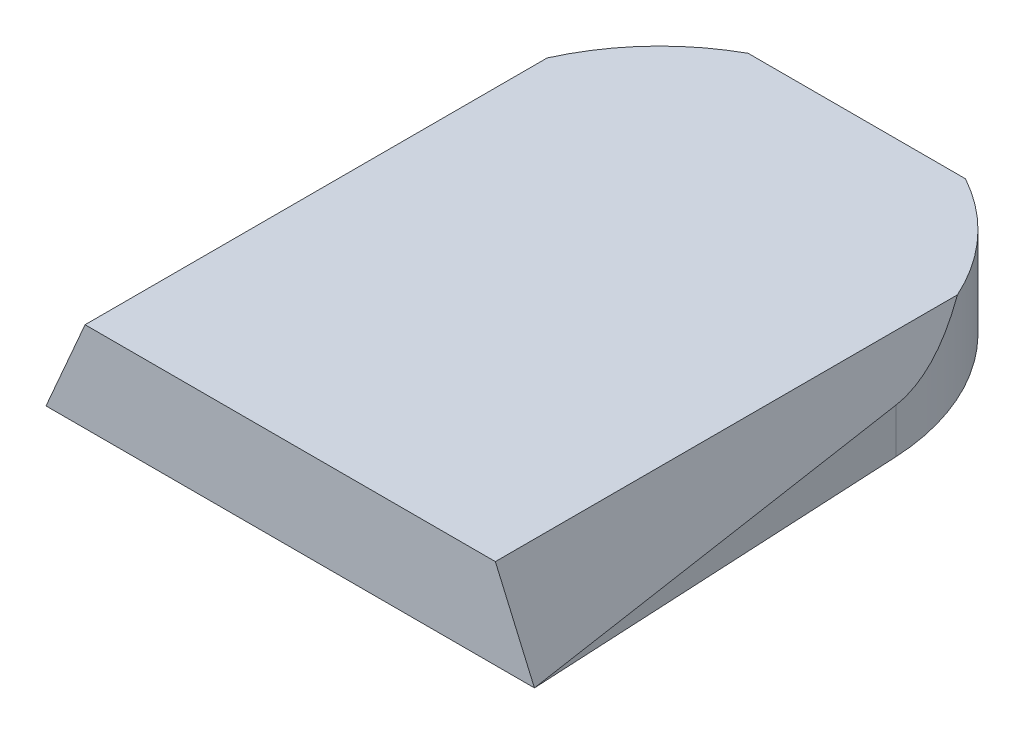
ISO-10303-21;
HEADER;
FILE_DESCRIPTION(('STEP AP214'),'2;1');
FILE_NAME('part.step','',(''),(''),'','','');
FILE_SCHEMA(('AUTOMOTIVE_DESIGN { 1 0 10303 214 1 1 1 1 }'));
ENDSEC;
DATA;
#1=APPLICATION_CONTEXT('core data for automotive mechanical design processes');
#2=APPLICATION_PROTOCOL_DEFINITION('international standard','automotive_design',2000,#1);
#3=PRODUCT_CONTEXT('',#1,'mechanical');
#4=PRODUCT('Part','Part','',(#3));
#5=PRODUCT_RELATED_PRODUCT_CATEGORY('part','',(#4));
#6=PRODUCT_DEFINITION_FORMATION('','',#4);
#7=PRODUCT_DEFINITION_CONTEXT('part definition',#1,'design');
#8=PRODUCT_DEFINITION('design','',#6,#7);
#9=PRODUCT_DEFINITION_SHAPE('','',#8);
#10=(LENGTH_UNIT() NAMED_UNIT(*) SI_UNIT(.MILLI.,.METRE.));
#11=(NAMED_UNIT(*) PLANE_ANGLE_UNIT() SI_UNIT($,.RADIAN.));
#12=(NAMED_UNIT(*) SI_UNIT($,.STERADIAN.) SOLID_ANGLE_UNIT());
#13=UNCERTAINTY_MEASURE_WITH_UNIT(LENGTH_MEASURE(1.E-05),#10,'distance_accuracy_value','');
#14=(GEOMETRIC_REPRESENTATION_CONTEXT(3) GLOBAL_UNCERTAINTY_ASSIGNED_CONTEXT((#13)) GLOBAL_UNIT_ASSIGNED_CONTEXT((#10,
#11,#12)) REPRESENTATION_CONTEXT('',''));
#15=CARTESIAN_POINT('',(0.,0.,0.));
#16=DIRECTION('',(0.,0.,1.));
#17=DIRECTION('',(1.,0.,0.));
#18=AXIS2_PLACEMENT_3D('',#15,#16,#17);
#19=CARTESIAN_POINT('',(1.57442748091604,4.6,-18.9124376621993));
#20=DIRECTION('',(0.,-1.,0.));
#21=DIRECTION('',(0.,0.,-1.));
#22=AXIS2_PLACEMENT_3D('',#19,#20,#21);
#23=CYLINDRICAL_SURFACE('',#22,11.5192453920989);
#24=CARTESIAN_POINT('',(1.57442748091604,28.75,-18.9124376621993));
#25=DIRECTION('',(-0.917070056253235,-0.39872611141445,0.));
#26=DIRECTION('',(0.39872611141445,-0.917070056253235,0.));
#27=AXIS2_PLACEMENT_3D('',#24,#25,#26);
#28=ELLIPSE('',#27,28.8901204669924,11.5192453920989);
#29=CARTESIAN_POINT('',(13.0786837409329,2.2902106019612,-19.4998917516859));
#30=VERTEX_POINT('',#29);
#31=CARTESIAN_POINT('',(12.074427480916,4.6,-23.6498435349731));
#32=VERTEX_POINT('',#31);
#33=EDGE_CURVE('E61',#30,#32,#28,.F.);
#34=ORIENTED_EDGE('',*,*,#33,.F.);
#35=DIRECTION('',(0.,-1.,0.));
#36=VECTOR('',#35,1.);
#37=CARTESIAN_POINT('',(13.0786837409329,4.6,-19.4998917516859));
#38=LINE('',#37,#36);
#39=CARTESIAN_POINT('',(13.0786837409329,0.,-19.4998917516859));
#40=VERTEX_POINT('',#39);
#41=EDGE_CURVE('E133',#30,#40,#38,.T.);
#42=ORIENTED_EDGE('',*,*,#41,.T.);
#43=CARTESIAN_POINT('',(1.57442748091604,0.,-18.9124376621993));
#44=DIRECTION('',(0.,1.,0.));
#45=DIRECTION('',(0.,0.,1.));
#46=AXIS2_PLACEMENT_3D('',#43,#44,#45);
#47=CIRCLE('',#46,11.5192453920989);
#48=CARTESIAN_POINT('',(7.13627074411365,0.,-29.));
#49=VERTEX_POINT('',#48);
#50=EDGE_CURVE('E148',#49,#40,#47,.F.);
#51=ORIENTED_EDGE('',*,*,#50,.F.);
#52=DIRECTION('',(0.,-1.,0.));
#53=VECTOR('',#52,1.);
#54=CARTESIAN_POINT('',(7.13627074411365,4.6,-29.));
#55=LINE('',#54,#53);
#56=CARTESIAN_POINT('',(7.13627074411365,4.6,-29.));
#57=VERTEX_POINT('',#56);
#58=EDGE_CURVE('E11',#57,#49,#55,.T.);
#59=ORIENTED_EDGE('',*,*,#58,.F.);
#60=CARTESIAN_POINT('',(1.57442748091604,4.6,-18.9124376621993));
#61=DIRECTION('',(0.,1.,0.));
#62=DIRECTION('',(0.,0.,1.));
#63=AXIS2_PLACEMENT_3D('',#60,#61,#62);
#64=CIRCLE('',#63,11.5192453920989);
#65=EDGE_CURVE('E129',#57,#32,#64,.F.);
#66=ORIENTED_EDGE('',*,*,#65,.T.);
#67=EDGE_LOOP('',(#34,#42,#51,#59,#66));
#68=FACE_BOUND('',#67,.T.);
#69=ADVANCED_FACE('F39',(#68),#23,.T.);
#70=CARTESIAN_POINT('',(0.,4.6,-29.));
#71=DIRECTION('',(0.,0.,-1.));
#72=DIRECTION('',(-1.,0.,0.));
#73=AXIS2_PLACEMENT_3D('',#70,#71,#72);
#74=PLANE('',#73);
#75=DIRECTION('',(1.,0.,0.));
#76=VECTOR('',#75,1.);
#77=CARTESIAN_POINT('',(0.,0.,-29.));
#78=LINE('',#77,#76);
#79=CARTESIAN_POINT('',(-3.98741578228157,0.,-29.));
#80=VERTEX_POINT('',#79);
#81=EDGE_CURVE('E145',#80,#49,#78,.T.);
#82=ORIENTED_EDGE('',*,*,#81,.F.);
#83=DIRECTION('',(0.,-1.,0.));
#84=VECTOR('',#83,1.);
#85=CARTESIAN_POINT('',(-3.98741578228157,4.6,-29.));
#86=LINE('',#85,#84);
#87=CARTESIAN_POINT('',(-3.98741578228157,4.6,-29.));
#88=VERTEX_POINT('',#87);
#89=EDGE_CURVE('E46',#88,#80,#86,.T.);
#90=ORIENTED_EDGE('',*,*,#89,.F.);
#91=DIRECTION('',(1.,0.,0.));
#92=VECTOR('',#91,1.);
#93=CARTESIAN_POINT('',(0.,4.6,-29.));
#94=LINE('',#93,#92);
#95=EDGE_CURVE('E154',#88,#57,#94,.T.);
#96=ORIENTED_EDGE('',*,*,#95,.T.);
#97=ORIENTED_EDGE('',*,*,#58,.T.);
#98=EDGE_LOOP('',(#82,#90,#96,#97));
#99=FACE_BOUND('',#98,.T.);
#100=ADVANCED_FACE('F146',(#99),#74,.T.);
#101=CARTESIAN_POINT('',(1.57442748091604,4.6,-18.9124376621993));
#102=DIRECTION('',(0.,-1.,0.));
#103=DIRECTION('',(0.,0.,-1.));
#104=AXIS2_PLACEMENT_3D('',#101,#102,#103);
#105=CYLINDRICAL_SURFACE('',#104,11.5192453920989);
#106=CARTESIAN_POINT('',(1.57442748091604,28.75,-18.9124376621993));
#107=DIRECTION('',(0.917070056253235,-0.39872611141445,0.));
#108=DIRECTION('',(-0.39872611141445,-0.917070056253235,0.));
#109=AXIS2_PLACEMENT_3D('',#106,#107,#108);
#110=ELLIPSE('',#109,28.8901204669924,11.5192453920989);
#111=CARTESIAN_POINT('',(-8.92557251908396,4.6,-23.6498435349731));
#112=VERTEX_POINT('',#111);
#113=CARTESIAN_POINT('',(-9.92982877910083,2.2902106019612,-19.4998917516859));
#114=VERTEX_POINT('',#113);
#115=EDGE_CURVE('E97',#112,#114,#110,.F.);
#116=ORIENTED_EDGE('',*,*,#115,.F.);
#117=CARTESIAN_POINT('',(1.57442748091604,4.6,-18.9124376621993));
#118=DIRECTION('',(0.,1.,0.));
#119=DIRECTION('',(0.,0.,1.));
#120=AXIS2_PLACEMENT_3D('',#117,#118,#119);
#121=CIRCLE('',#120,11.5192453920989);
#122=EDGE_CURVE('E140',#112,#88,#121,.F.);
#123=ORIENTED_EDGE('',*,*,#122,.T.);
#124=ORIENTED_EDGE('',*,*,#89,.T.);
#125=CARTESIAN_POINT('',(1.57442748091604,0.,-18.9124376621993));
#126=DIRECTION('',(0.,1.,0.));
#127=DIRECTION('',(0.,0.,1.));
#128=AXIS2_PLACEMENT_3D('',#125,#126,#127);
#129=CIRCLE('',#128,11.5192453920989);
#130=CARTESIAN_POINT('',(-9.92982877910083,0.,-19.4998917516859));
#131=VERTEX_POINT('',#130);
#132=EDGE_CURVE('E122',#131,#80,#129,.F.);
#133=ORIENTED_EDGE('',*,*,#132,.F.);
#134=DIRECTION('',(0.,-1.,0.));
#135=VECTOR('',#134,1.);
#136=CARTESIAN_POINT('',(-9.92982877910083,4.6,-19.4998917516859));
#137=LINE('',#136,#135);
#138=EDGE_CURVE('E118',#114,#131,#137,.T.);
#139=ORIENTED_EDGE('',*,*,#138,.F.);
#140=EDGE_LOOP('',(#116,#123,#124,#133,#139));
#141=FACE_BOUND('',#140,.T.);
#142=ADVANCED_FACE('F138',(#141),#105,.T.);
#143=CARTESIAN_POINT('',(-10.8971577581309,4.6,-0.556453172122318));
#144=DIRECTION('',(0.998698774826664,0.,0.0509976191573728));
#145=DIRECTION('',(0.0509976191573728,0.,-0.998698774826664));
#146=AXIS2_PLACEMENT_3D('',#143,#144,#145);
#147=PLANE('',#146);
#148=DIRECTION('',(-0.0509976191573728,0.,0.998698774826664));
#149=VECTOR('',#148,1.);
#150=CARTESIAN_POINT('',(-10.8971577581309,0.,-0.556453172122318));
#151=LINE('',#150,#149);
#152=CARTESIAN_POINT('',(-10.925572519084,0.,0.));
#153=VERTEX_POINT('',#152);
#154=EDGE_CURVE('E116',#131,#153,#151,.T.);
#155=ORIENTED_EDGE('',*,*,#154,.T.);
#156=DIRECTION('',(0.0506503852527608,0.11649588608135,-0.991898808850917));
#157=VECTOR('',#156,1.);
#158=CARTESIAN_POINT('',(-10.8704008001862,0.126894953464841,-1.08044118487645));
#159=LINE('',#158,#157);
#160=EDGE_CURVE('E94',#153,#114,#159,.T.);
#161=ORIENTED_EDGE('',*,*,#160,.T.);
#162=ORIENTED_EDGE('',*,*,#138,.T.);
#163=EDGE_LOOP('',(#155,#161,#162));
#164=FACE_BOUND('',#163,.T.);
#165=ADVANCED_FACE('F117',(#164),#147,.F.);
#166=CARTESIAN_POINT('',(0.,4.6,0.));
#167=DIRECTION('',(0.,0.,-1.));
#168=DIRECTION('',(-1.,0.,0.));
#169=AXIS2_PLACEMENT_3D('',#166,#167,#168);
#170=PLANE('',#169);
#171=DIRECTION('',(1.,0.,0.));
#172=VECTOR('',#171,1.);
#173=CARTESIAN_POINT('',(0.,4.6,0.));
#174=LINE('',#173,#172);
#175=CARTESIAN_POINT('',(-8.92557251908396,4.6,0.));
#176=VERTEX_POINT('',#175);
#177=CARTESIAN_POINT('',(12.074427480916,4.6,0.));
#178=VERTEX_POINT('',#177);
#179=EDGE_CURVE('E111',#176,#178,#174,.T.);
#180=ORIENTED_EDGE('',*,*,#179,.F.);
#181=DIRECTION('',(0.39872611141445,0.917070056253235,0.));
#182=VECTOR('',#181,1.);
#183=CARTESIAN_POINT('',(-10.925572519084,0.,0.));
#184=LINE('',#183,#182);
#185=EDGE_CURVE('E53',#153,#176,#184,.T.);
#186=ORIENTED_EDGE('',*,*,#185,.F.);
#187=DIRECTION('',(1.,0.,0.));
#188=VECTOR('',#187,1.);
#189=CARTESIAN_POINT('',(0.,0.,0.));
#190=LINE('',#189,#188);
#191=CARTESIAN_POINT('',(14.074427480916,0.,0.));
#192=VERTEX_POINT('',#191);
#193=EDGE_CURVE('E108',#153,#192,#190,.T.);
#194=ORIENTED_EDGE('',*,*,#193,.T.);
#195=DIRECTION('',(0.39872611141445,-0.917070056253235,0.));
#196=VECTOR('',#195,1.);
#197=CARTESIAN_POINT('',(14.074427480916,0.,0.));
#198=LINE('',#197,#196);
#199=EDGE_CURVE('E163',#178,#192,#198,.T.);
#200=ORIENTED_EDGE('',*,*,#199,.F.);
#201=EDGE_LOOP('',(#180,#186,#194,#200));
#202=FACE_BOUND('',#201,.T.);
#203=ADVANCED_FACE('F105',(#202),#170,.F.);
#204=CARTESIAN_POINT('',(14.0378233128761,4.6,-0.716828322166308));
#205=DIRECTION('',(0.998698774826664,0.,-0.0509976191573729));
#206=DIRECTION('',(-0.0509976191573729,0.,-0.998698774826664));
#207=AXIS2_PLACEMENT_3D('',#204,#205,#206);
#208=PLANE('',#207);
#209=DIRECTION('',(-0.0506503852527609,0.11649588608135,-0.991898808850917));
#210=VECTOR('',#209,1.);
#211=CARTESIAN_POINT('',(14.011177495762,0.145474965854404,-1.23863983701402));
#212=LINE('',#211,#210);
#213=EDGE_CURVE('E160',#192,#30,#212,.T.);
#214=ORIENTED_EDGE('',*,*,#213,.F.);
#215=DIRECTION('',(0.0509976191573729,0.,0.998698774826664));
#216=VECTOR('',#215,1.);
#217=CARTESIAN_POINT('',(14.0378233128761,0.,-0.716828322166308));
#218=LINE('',#217,#216);
#219=EDGE_CURVE('E127',#40,#192,#218,.T.);
#220=ORIENTED_EDGE('',*,*,#219,.F.);
#221=ORIENTED_EDGE('',*,*,#41,.F.);
#222=EDGE_LOOP('',(#214,#220,#221));
#223=FACE_BOUND('',#222,.T.);
#224=ADVANCED_FACE('F172',(#223),#208,.T.);
#225=CARTESIAN_POINT('',(0.,4.6,0.));
#226=DIRECTION('',(0.,1.,0.));
#227=DIRECTION('',(0.,0.,1.));
#228=AXIS2_PLACEMENT_3D('',#225,#226,#227);
#229=PLANE('',#228);
#230=DIRECTION('',(0.,0.,1.));
#231=VECTOR('',#230,1.);
#232=CARTESIAN_POINT('',(-8.92557251908396,4.6,-29.));
#233=LINE('',#232,#231);
#234=EDGE_CURVE('E112',#112,#176,#233,.T.);
#235=ORIENTED_EDGE('',*,*,#234,.T.);
#236=ORIENTED_EDGE('',*,*,#179,.T.);
#237=DIRECTION('',(0.,0.,1.));
#238=VECTOR('',#237,1.);
#239=CARTESIAN_POINT('',(12.074427480916,4.6,-29.));
#240=LINE('',#239,#238);
#241=EDGE_CURVE('E113',#32,#178,#240,.T.);
#242=ORIENTED_EDGE('',*,*,#241,.F.);
#243=ORIENTED_EDGE('',*,*,#65,.F.);
#244=ORIENTED_EDGE('',*,*,#95,.F.);
#245=ORIENTED_EDGE('',*,*,#122,.F.);
#246=EDGE_LOOP('',(#235,#236,#242,#243,#244,#245));
#247=FACE_BOUND('',#246,.T.);
#248=ADVANCED_FACE('F166',(#247),#229,.T.);
#249=CARTESIAN_POINT('',(0.,0.,0.));
#250=DIRECTION('',(0.,1.,0.));
#251=DIRECTION('',(0.,0.,1.));
#252=AXIS2_PLACEMENT_3D('',#249,#250,#251);
#253=PLANE('',#252);
#254=ORIENTED_EDGE('',*,*,#50,.T.);
#255=ORIENTED_EDGE('',*,*,#219,.T.);
#256=ORIENTED_EDGE('',*,*,#193,.F.);
#257=ORIENTED_EDGE('',*,*,#154,.F.);
#258=ORIENTED_EDGE('',*,*,#132,.T.);
#259=ORIENTED_EDGE('',*,*,#81,.T.);
#260=EDGE_LOOP('',(#254,#255,#256,#257,#258,#259));
#261=FACE_BOUND('',#260,.T.);
#262=ADVANCED_FACE('F125',(#261),#253,.F.);
#263=CARTESIAN_POINT('',(14.074427480916,0.,-29.));
#264=DIRECTION('',(-0.917070056253235,-0.39872611141445,0.));
#265=DIRECTION('',(0.39872611141445,-0.917070056253235,0.));
#266=AXIS2_PLACEMENT_3D('',#263,#264,#265);
#267=PLANE('',#266);
#268=ORIENTED_EDGE('',*,*,#33,.T.);
#269=ORIENTED_EDGE('',*,*,#241,.T.);
#270=ORIENTED_EDGE('',*,*,#199,.T.);
#271=ORIENTED_EDGE('',*,*,#213,.T.);
#272=EDGE_LOOP('',(#268,#269,#270,#271));
#273=FACE_BOUND('',#272,.T.);
#274=ADVANCED_FACE('F173',(#273),#267,.F.);
#275=CARTESIAN_POINT('',(-10.925572519084,0.,-29.));
#276=DIRECTION('',(0.917070056253235,-0.39872611141445,0.));
#277=DIRECTION('',(0.39872611141445,0.917070056253235,0.));
#278=AXIS2_PLACEMENT_3D('',#275,#276,#277);
#279=PLANE('',#278);
#280=ORIENTED_EDGE('',*,*,#115,.T.);
#281=ORIENTED_EDGE('',*,*,#160,.F.);
#282=ORIENTED_EDGE('',*,*,#185,.T.);
#283=ORIENTED_EDGE('',*,*,#234,.F.);
#284=EDGE_LOOP('',(#280,#281,#282,#283));
#285=FACE_BOUND('',#284,.T.);
#286=ADVANCED_FACE('F95',(#285),#279,.F.);
#287=CLOSED_SHELL('',(#69,#100,#142,#165,#203,#224,#248,#262,#274,#286));
#288=MANIFOLD_SOLID_BREP('B2',#287);
#289=ADVANCED_BREP_SHAPE_REPRESENTATION('',(#18,#288),#14);
#290=SHAPE_DEFINITION_REPRESENTATION(#9,#289);
ENDSEC;
END-ISO-10303-21;
